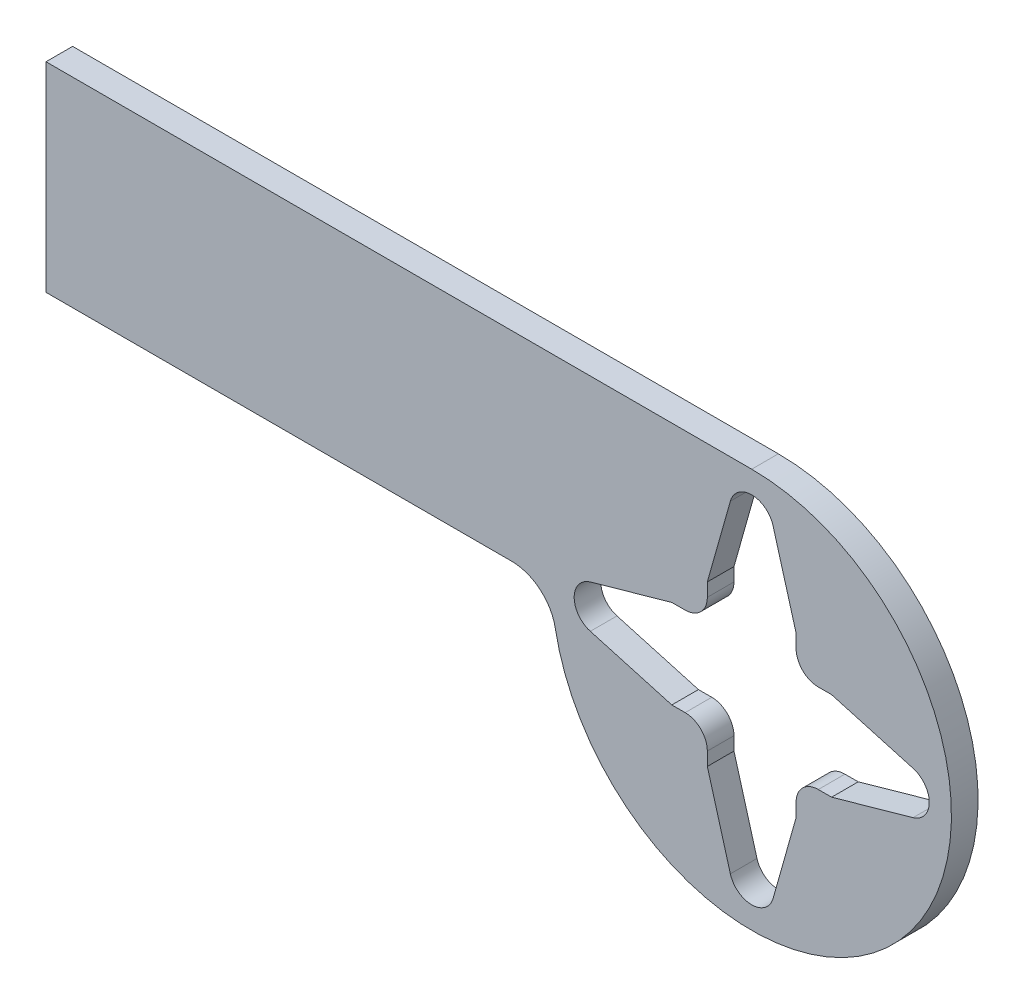
ISO-10303-21;
HEADER;
FILE_DESCRIPTION(('STEP AP214'),'2;1');
FILE_NAME('part.step','',(''),(''),'','','');
FILE_SCHEMA(('AUTOMOTIVE_DESIGN { 1 0 10303 214 1 1 1 1 }'));
ENDSEC;
DATA;
#1=APPLICATION_CONTEXT('core data for automotive mechanical design processes');
#2=APPLICATION_PROTOCOL_DEFINITION('international standard','automotive_design',2000,#1);
#3=PRODUCT_CONTEXT('',#1,'mechanical');
#4=PRODUCT('Part','Part','',(#3));
#5=PRODUCT_RELATED_PRODUCT_CATEGORY('part','',(#4));
#6=PRODUCT_DEFINITION_FORMATION('','',#4);
#7=PRODUCT_DEFINITION_CONTEXT('part definition',#1,'design');
#8=PRODUCT_DEFINITION('design','',#6,#7);
#9=PRODUCT_DEFINITION_SHAPE('','',#8);
#10=(LENGTH_UNIT() NAMED_UNIT(*) SI_UNIT(.MILLI.,.METRE.));
#11=(NAMED_UNIT(*) PLANE_ANGLE_UNIT() SI_UNIT($,.RADIAN.));
#12=(NAMED_UNIT(*) SI_UNIT($,.STERADIAN.) SOLID_ANGLE_UNIT());
#13=UNCERTAINTY_MEASURE_WITH_UNIT(LENGTH_MEASURE(1.E-05),#10,'distance_accuracy_value','');
#14=(GEOMETRIC_REPRESENTATION_CONTEXT(3) GLOBAL_UNCERTAINTY_ASSIGNED_CONTEXT((#13)) GLOBAL_UNIT_ASSIGNED_CONTEXT((#10,
#11,#12)) REPRESENTATION_CONTEXT('',''));
#15=CARTESIAN_POINT('',(0.,0.,0.));
#16=DIRECTION('',(0.,0.,1.));
#17=DIRECTION('',(1.,0.,0.));
#18=AXIS2_PLACEMENT_3D('',#15,#16,#17);
#19=CARTESIAN_POINT('',(0.,0.,3.));
#20=DIRECTION('',(0.,0.,-1.));
#21=DIRECTION('',(-1.,0.,0.));
#22=AXIS2_PLACEMENT_3D('',#19,#20,#21);
#23=CYLINDRICAL_SURFACE('',#22,22.5);
#24=CARTESIAN_POINT('',(0.,0.,0.));
#25=DIRECTION('',(0.,0.,1.));
#26=DIRECTION('',(1.,0.,0.));
#27=AXIS2_PLACEMENT_3D('',#24,#25,#26);
#28=CIRCLE('',#27,22.5);
#29=CARTESIAN_POINT('',(-22.1249737358018,-4.09090909090909,0.));
#30=VERTEX_POINT('',#29);
#31=CARTESIAN_POINT('',(0.,22.5,0.));
#32=VERTEX_POINT('',#31);
#33=EDGE_CURVE('E355',#30,#32,#28,.T.);
#34=ORIENTED_EDGE('',*,*,#33,.T.);
#35=DIRECTION('',(0.,0.,-1.));
#36=VECTOR('',#35,1.);
#37=CARTESIAN_POINT('',(0.,22.5,3.));
#38=LINE('',#37,#36);
#39=CARTESIAN_POINT('',(0.,22.5,3.));
#40=VERTEX_POINT('',#39);
#41=EDGE_CURVE('E195',#40,#32,#38,.T.);
#42=ORIENTED_EDGE('',*,*,#41,.F.);
#43=CARTESIAN_POINT('',(0.,0.,3.));
#44=DIRECTION('',(0.,0.,1.));
#45=DIRECTION('',(1.,0.,0.));
#46=AXIS2_PLACEMENT_3D('',#43,#44,#45);
#47=CIRCLE('',#46,22.5);
#48=CARTESIAN_POINT('',(-22.1249737358018,-4.09090909090909,3.));
#49=VERTEX_POINT('',#48);
#50=EDGE_CURVE('E378',#49,#40,#47,.T.);
#51=ORIENTED_EDGE('',*,*,#50,.F.);
#52=DIRECTION('',(0.,0.,-1.));
#53=VECTOR('',#52,1.);
#54=CARTESIAN_POINT('',(-22.1249737358018,-4.09090909090909,3.));
#55=LINE('',#54,#53);
#56=EDGE_CURVE('E12',#49,#30,#55,.T.);
#57=ORIENTED_EDGE('',*,*,#56,.T.);
#58=EDGE_LOOP('',(#34,#42,#51,#57));
#59=FACE_BOUND('',#58,.T.);
#60=ADVANCED_FACE('F184',(#59),#23,.T.);
#61=CARTESIAN_POINT('',(5.,0.,3.));
#62=DIRECTION('',(1.,0.,0.));
#63=DIRECTION('',(0.,0.,-1.));
#64=AXIS2_PLACEMENT_3D('',#61,#62,#63);
#65=PLANE('',#64);
#66=DIRECTION('',(0.,-1.,0.));
#67=VECTOR('',#66,1.);
#68=CARTESIAN_POINT('',(5.,0.,0.));
#69=LINE('',#68,#67);
#70=CARTESIAN_POINT('',(5.,-7.5,0.));
#71=VERTEX_POINT('',#70);
#72=CARTESIAN_POINT('',(5.,-9.,0.));
#73=VERTEX_POINT('',#72);
#74=EDGE_CURVE('E456',#71,#73,#69,.T.);
#75=ORIENTED_EDGE('',*,*,#74,.T.);
#76=DIRECTION('',(0.,0.,-1.));
#77=VECTOR('',#76,1.);
#78=CARTESIAN_POINT('',(5.,-9.,3.));
#79=LINE('',#78,#77);
#80=CARTESIAN_POINT('',(5.,-9.,3.));
#81=VERTEX_POINT('',#80);
#82=EDGE_CURVE('E446',#81,#73,#79,.T.);
#83=ORIENTED_EDGE('',*,*,#82,.F.);
#84=DIRECTION('',(0.,-1.,0.));
#85=VECTOR('',#84,1.);
#86=CARTESIAN_POINT('',(5.,0.,3.));
#87=LINE('',#86,#85);
#88=CARTESIAN_POINT('',(5.,-7.5,3.));
#89=VERTEX_POINT('',#88);
#90=EDGE_CURVE('E358',#89,#81,#87,.T.);
#91=ORIENTED_EDGE('',*,*,#90,.F.);
#92=DIRECTION('',(0.,0.,-1.));
#93=VECTOR('',#92,1.);
#94=CARTESIAN_POINT('',(5.,-7.5,3.));
#95=LINE('',#94,#93);
#96=EDGE_CURVE('E372',#89,#71,#95,.T.);
#97=ORIENTED_EDGE('',*,*,#96,.T.);
#98=EDGE_LOOP('',(#75,#83,#91,#97));
#99=FACE_BOUND('',#98,.T.);
#100=ADVANCED_FACE('F820',(#99),#65,.F.);
#101=CARTESIAN_POINT('',(6.98551163473582,-1.97409711694024,3.));
#102=DIRECTION('',(0.962311898410698,-0.271948175535705,0.));
#103=DIRECTION('',(0.271948175535705,0.962311898410698,0.));
#104=AXIS2_PLACEMENT_3D('',#101,#102,#103);
#105=PLANE('',#104);
#106=DIRECTION('',(-0.271948175535705,-0.962311898410698,0.));
#107=VECTOR('',#106,1.);
#108=CARTESIAN_POINT('',(6.98551163473582,-1.97409711694024,0.));
#109=LINE('',#108,#107);
#110=CARTESIAN_POINT('',(2.40577974602674,-18.1798704388393,0.));
#111=VERTEX_POINT('',#110);
#112=EDGE_CURVE('E500',#73,#111,#109,.T.);
#113=ORIENTED_EDGE('',*,*,#112,.T.);
#114=DIRECTION('',(0.,0.,-1.));
#115=VECTOR('',#114,1.);
#116=CARTESIAN_POINT('',(2.40577974602674,-18.1798704388393,3.));
#117=LINE('',#116,#115);
#118=CARTESIAN_POINT('',(2.40577974602674,-18.1798704388393,3.));
#119=VERTEX_POINT('',#118);
#120=EDGE_CURVE('E442',#119,#111,#117,.T.);
#121=ORIENTED_EDGE('',*,*,#120,.F.);
#122=DIRECTION('',(-0.271948175535705,-0.962311898410698,0.));
#123=VECTOR('',#122,1.);
#124=CARTESIAN_POINT('',(6.98551163473582,-1.97409711694024,3.));
#125=LINE('',#124,#123);
#126=EDGE_CURVE('E364',#81,#119,#125,.T.);
#127=ORIENTED_EDGE('',*,*,#126,.F.);
#128=ORIENTED_EDGE('',*,*,#82,.T.);
#129=EDGE_LOOP('',(#113,#121,#127,#128));
#130=FACE_BOUND('',#129,.T.);
#131=ADVANCED_FACE('F703',(#130),#105,.F.);
#132=CARTESIAN_POINT('',(0.,-17.5,3.));
#133=DIRECTION('',(0.,0.,-1.));
#134=DIRECTION('',(-1.,0.,0.));
#135=AXIS2_PLACEMENT_3D('',#132,#133,#134);
#136=CYLINDRICAL_SURFACE('',#135,2.5);
#137=CARTESIAN_POINT('',(0.,-17.5,0.));
#138=DIRECTION('',(0.,0.,1.));
#139=DIRECTION('',(1.,0.,0.));
#140=AXIS2_PLACEMENT_3D('',#137,#138,#139);
#141=CIRCLE('',#140,2.5);
#142=CARTESIAN_POINT('',(-2.40577974602674,-18.1798704388393,0.));
#143=VERTEX_POINT('',#142);
#144=EDGE_CURVE('E503',#111,#143,#141,.F.);
#145=ORIENTED_EDGE('',*,*,#144,.T.);
#146=DIRECTION('',(0.,0.,-1.));
#147=VECTOR('',#146,1.);
#148=CARTESIAN_POINT('',(-2.40577974602674,-18.1798704388393,3.));
#149=LINE('',#148,#147);
#150=CARTESIAN_POINT('',(-2.40577974602674,-18.1798704388393,3.));
#151=VERTEX_POINT('',#150);
#152=EDGE_CURVE('E439',#151,#143,#149,.T.);
#153=ORIENTED_EDGE('',*,*,#152,.F.);
#154=CARTESIAN_POINT('',(0.,-17.5,3.));
#155=DIRECTION('',(0.,0.,1.));
#156=DIRECTION('',(1.,0.,0.));
#157=AXIS2_PLACEMENT_3D('',#154,#155,#156);
#158=CIRCLE('',#157,2.5);
#159=EDGE_CURVE('E686',#119,#151,#158,.F.);
#160=ORIENTED_EDGE('',*,*,#159,.F.);
#161=ORIENTED_EDGE('',*,*,#120,.T.);
#162=EDGE_LOOP('',(#145,#153,#160,#161));
#163=FACE_BOUND('',#162,.T.);
#164=ADVANCED_FACE('F707',(#163),#136,.F.);
#165=CARTESIAN_POINT('',(-6.98551163473582,-1.97409711694024,3.));
#166=DIRECTION('',(0.962311898410698,0.271948175535705,0.));
#167=DIRECTION('',(-0.271948175535705,0.962311898410698,0.));
#168=AXIS2_PLACEMENT_3D('',#165,#166,#167);
#169=PLANE('',#168);
#170=DIRECTION('',(0.271948175535705,-0.962311898410698,0.));
#171=VECTOR('',#170,1.);
#172=CARTESIAN_POINT('',(-6.98551163473582,-1.97409711694024,0.));
#173=LINE('',#172,#171);
#174=CARTESIAN_POINT('',(-5.,-9.,0.));
#175=VERTEX_POINT('',#174);
#176=EDGE_CURVE('E507',#175,#143,#173,.T.);
#177=ORIENTED_EDGE('',*,*,#176,.F.);
#178=DIRECTION('',(0.,0.,-1.));
#179=VECTOR('',#178,1.);
#180=CARTESIAN_POINT('',(-5.,-9.,3.));
#181=LINE('',#180,#179);
#182=CARTESIAN_POINT('',(-5.,-9.,3.));
#183=VERTEX_POINT('',#182);
#184=EDGE_CURVE('E436',#183,#175,#181,.T.);
#185=ORIENTED_EDGE('',*,*,#184,.F.);
#186=DIRECTION('',(0.271948175535705,-0.962311898410698,0.));
#187=VECTOR('',#186,1.);
#188=CARTESIAN_POINT('',(-6.98551163473582,-1.97409711694024,3.));
#189=LINE('',#188,#187);
#190=EDGE_CURVE('E682',#183,#151,#189,.T.);
#191=ORIENTED_EDGE('',*,*,#190,.T.);
#192=ORIENTED_EDGE('',*,*,#152,.T.);
#193=EDGE_LOOP('',(#177,#185,#191,#192));
#194=FACE_BOUND('',#193,.T.);
#195=ADVANCED_FACE('F713',(#194),#169,.T.);
#196=CARTESIAN_POINT('',(-5.,0.,3.));
#197=DIRECTION('',(1.,0.,0.));
#198=DIRECTION('',(0.,0.,-1.));
#199=AXIS2_PLACEMENT_3D('',#196,#197,#198);
#200=PLANE('',#199);
#201=DIRECTION('',(0.,-1.,0.));
#202=VECTOR('',#201,1.);
#203=CARTESIAN_POINT('',(-5.,0.,0.));
#204=LINE('',#203,#202);
#205=CARTESIAN_POINT('',(-5.,-7.5,0.));
#206=VERTEX_POINT('',#205);
#207=EDGE_CURVE('E511',#206,#175,#204,.T.);
#208=ORIENTED_EDGE('',*,*,#207,.F.);
#209=DIRECTION('',(0.,0.,-1.));
#210=VECTOR('',#209,1.);
#211=CARTESIAN_POINT('',(-5.,-7.5,3.));
#212=LINE('',#211,#210);
#213=CARTESIAN_POINT('',(-5.,-7.5,3.));
#214=VERTEX_POINT('',#213);
#215=EDGE_CURVE('E433',#214,#206,#212,.T.);
#216=ORIENTED_EDGE('',*,*,#215,.F.);
#217=DIRECTION('',(0.,-1.,0.));
#218=VECTOR('',#217,1.);
#219=CARTESIAN_POINT('',(-5.,0.,3.));
#220=LINE('',#219,#218);
#221=EDGE_CURVE('E678',#214,#183,#220,.T.);
#222=ORIENTED_EDGE('',*,*,#221,.T.);
#223=ORIENTED_EDGE('',*,*,#184,.T.);
#224=EDGE_LOOP('',(#208,#216,#222,#223));
#225=FACE_BOUND('',#224,.T.);
#226=ADVANCED_FACE('F721',(#225),#200,.T.);
#227=CARTESIAN_POINT('',(0.,-5.,3.));
#228=DIRECTION('',(0.,-1.,0.));
#229=DIRECTION('',(1.,0.,0.));
#230=AXIS2_PLACEMENT_3D('',#227,#228,#229);
#231=PLANE('',#230);
#232=DIRECTION('',(-1.,0.,0.));
#233=VECTOR('',#232,1.);
#234=CARTESIAN_POINT('',(0.,-5.,0.));
#235=LINE('',#234,#233);
#236=CARTESIAN_POINT('',(-7.5,-5.,0.));
#237=VERTEX_POINT('',#236);
#238=CARTESIAN_POINT('',(-9.,-5.,0.));
#239=VERTEX_POINT('',#238);
#240=EDGE_CURVE('E515',#237,#239,#235,.T.);
#241=ORIENTED_EDGE('',*,*,#240,.T.);
#242=DIRECTION('',(0.,0.,-1.));
#243=VECTOR('',#242,1.);
#244=CARTESIAN_POINT('',(-9.,-5.,3.));
#245=LINE('',#244,#243);
#246=CARTESIAN_POINT('',(-9.,-5.,3.));
#247=VERTEX_POINT('',#246);
#248=EDGE_CURVE('E426',#247,#239,#245,.T.);
#249=ORIENTED_EDGE('',*,*,#248,.F.);
#250=DIRECTION('',(-1.,0.,0.));
#251=VECTOR('',#250,1.);
#252=CARTESIAN_POINT('',(0.,-5.,3.));
#253=LINE('',#252,#251);
#254=CARTESIAN_POINT('',(-7.5,-5.,3.));
#255=VERTEX_POINT('',#254);
#256=EDGE_CURVE('E674',#255,#247,#253,.T.);
#257=ORIENTED_EDGE('',*,*,#256,.F.);
#258=DIRECTION('',(0.,0.,-1.));
#259=VECTOR('',#258,1.);
#260=CARTESIAN_POINT('',(-7.5,-5.,3.));
#261=LINE('',#260,#259);
#262=EDGE_CURVE('E430',#255,#237,#261,.T.);
#263=ORIENTED_EDGE('',*,*,#262,.T.);
#264=EDGE_LOOP('',(#241,#249,#257,#263));
#265=FACE_BOUND('',#264,.T.);
#266=ADVANCED_FACE('F733',(#265),#231,.F.);
#267=CARTESIAN_POINT('',(-1.97409711694023,-6.98551163473581,3.));
#268=DIRECTION('',(-0.271948175535704,-0.962311898410698,0.));
#269=DIRECTION('',(0.962311898410698,-0.271948175535704,0.));
#270=AXIS2_PLACEMENT_3D('',#267,#268,#269);
#271=PLANE('',#270);
#272=DIRECTION('',(-0.962311898410698,0.271948175535704,0.));
#273=VECTOR('',#272,1.);
#274=CARTESIAN_POINT('',(-1.97409711694023,-6.98551163473581,0.));
#275=LINE('',#274,#273);
#276=CARTESIAN_POINT('',(-18.1798704388393,-2.40577974602675,0.));
#277=VERTEX_POINT('',#276);
#278=EDGE_CURVE('E518',#239,#277,#275,.T.);
#279=ORIENTED_EDGE('',*,*,#278,.T.);
#280=DIRECTION('',(0.,0.,-1.));
#281=VECTOR('',#280,1.);
#282=CARTESIAN_POINT('',(-18.1798704388393,-2.40577974602675,3.));
#283=LINE('',#282,#281);
#284=CARTESIAN_POINT('',(-18.1798704388393,-2.40577974602675,3.));
#285=VERTEX_POINT('',#284);
#286=EDGE_CURVE('E422',#285,#277,#283,.T.);
#287=ORIENTED_EDGE('',*,*,#286,.F.);
#288=DIRECTION('',(-0.962311898410698,0.271948175535704,0.));
#289=VECTOR('',#288,1.);
#290=CARTESIAN_POINT('',(-1.97409711694023,-6.98551163473581,3.));
#291=LINE('',#290,#289);
#292=EDGE_CURVE('E670',#247,#285,#291,.T.);
#293=ORIENTED_EDGE('',*,*,#292,.F.);
#294=ORIENTED_EDGE('',*,*,#248,.T.);
#295=EDGE_LOOP('',(#279,#287,#293,#294));
#296=FACE_BOUND('',#295,.T.);
#297=ADVANCED_FACE('F741',(#296),#271,.F.);
#298=CARTESIAN_POINT('',(-17.5,0.,3.));
#299=DIRECTION('',(0.,0.,-1.));
#300=DIRECTION('',(-1.,0.,0.));
#301=AXIS2_PLACEMENT_3D('',#298,#299,#300);
#302=CYLINDRICAL_SURFACE('',#301,2.5);
#303=CARTESIAN_POINT('',(-17.5,0.,0.));
#304=DIRECTION('',(0.,0.,1.));
#305=DIRECTION('',(1.,0.,0.));
#306=AXIS2_PLACEMENT_3D('',#303,#304,#305);
#307=CIRCLE('',#306,2.5);
#308=CARTESIAN_POINT('',(-18.1798704388393,2.40577974602675,0.));
#309=VERTEX_POINT('',#308);
#310=EDGE_CURVE('E521',#277,#309,#307,.F.);
#311=ORIENTED_EDGE('',*,*,#310,.T.);
#312=DIRECTION('',(0.,0.,-1.));
#313=VECTOR('',#312,1.);
#314=CARTESIAN_POINT('',(-18.1798704388393,2.40577974602675,3.));
#315=LINE('',#314,#313);
#316=CARTESIAN_POINT('',(-18.1798704388393,2.40577974602675,3.));
#317=VERTEX_POINT('',#316);
#318=EDGE_CURVE('E419',#317,#309,#315,.T.);
#319=ORIENTED_EDGE('',*,*,#318,.F.);
#320=CARTESIAN_POINT('',(-17.5,0.,3.));
#321=DIRECTION('',(0.,0.,1.));
#322=DIRECTION('',(1.,0.,0.));
#323=AXIS2_PLACEMENT_3D('',#320,#321,#322);
#324=CIRCLE('',#323,2.5);
#325=EDGE_CURVE('E666',#285,#317,#324,.F.);
#326=ORIENTED_EDGE('',*,*,#325,.F.);
#327=ORIENTED_EDGE('',*,*,#286,.T.);
#328=EDGE_LOOP('',(#311,#319,#326,#327));
#329=FACE_BOUND('',#328,.T.);
#330=ADVANCED_FACE('F793',(#329),#302,.F.);
#331=CARTESIAN_POINT('',(-1.97409711694023,6.98551163473581,3.));
#332=DIRECTION('',(0.271948175535704,-0.962311898410698,0.));
#333=DIRECTION('',(0.962311898410698,0.271948175535704,0.));
#334=AXIS2_PLACEMENT_3D('',#331,#332,#333);
#335=PLANE('',#334);
#336=DIRECTION('',(-0.962311898410698,-0.271948175535704,0.));
#337=VECTOR('',#336,1.);
#338=CARTESIAN_POINT('',(-1.97409711694023,6.98551163473581,0.));
#339=LINE('',#338,#337);
#340=CARTESIAN_POINT('',(-9.,5.,0.));
#341=VERTEX_POINT('',#340);
#342=EDGE_CURVE('E525',#341,#309,#339,.T.);
#343=ORIENTED_EDGE('',*,*,#342,.F.);
#344=DIRECTION('',(0.,0.,-1.));
#345=VECTOR('',#344,1.);
#346=CARTESIAN_POINT('',(-9.,5.,3.));
#347=LINE('',#346,#345);
#348=CARTESIAN_POINT('',(-9.,5.,3.));
#349=VERTEX_POINT('',#348);
#350=EDGE_CURVE('E416',#349,#341,#347,.T.);
#351=ORIENTED_EDGE('',*,*,#350,.F.);
#352=DIRECTION('',(-0.962311898410698,-0.271948175535704,0.));
#353=VECTOR('',#352,1.);
#354=CARTESIAN_POINT('',(-1.97409711694023,6.98551163473581,3.));
#355=LINE('',#354,#353);
#356=EDGE_CURVE('E662',#349,#317,#355,.T.);
#357=ORIENTED_EDGE('',*,*,#356,.T.);
#358=ORIENTED_EDGE('',*,*,#318,.T.);
#359=EDGE_LOOP('',(#343,#351,#357,#358));
#360=FACE_BOUND('',#359,.T.);
#361=ADVANCED_FACE('F790',(#360),#335,.T.);
#362=CARTESIAN_POINT('',(0.,5.,3.));
#363=DIRECTION('',(0.,-1.,0.));
#364=DIRECTION('',(1.,0.,0.));
#365=AXIS2_PLACEMENT_3D('',#362,#363,#364);
#366=PLANE('',#365);
#367=DIRECTION('',(-1.,0.,0.));
#368=VECTOR('',#367,1.);
#369=CARTESIAN_POINT('',(0.,5.,0.));
#370=LINE('',#369,#368);
#371=CARTESIAN_POINT('',(-7.5,5.,0.));
#372=VERTEX_POINT('',#371);
#373=EDGE_CURVE('E529',#372,#341,#370,.T.);
#374=ORIENTED_EDGE('',*,*,#373,.F.);
#375=DIRECTION('',(0.,0.,-1.));
#376=VECTOR('',#375,1.);
#377=CARTESIAN_POINT('',(-7.5,5.,3.));
#378=LINE('',#377,#376);
#379=CARTESIAN_POINT('',(-7.5,5.,3.));
#380=VERTEX_POINT('',#379);
#381=EDGE_CURVE('E413',#380,#372,#378,.T.);
#382=ORIENTED_EDGE('',*,*,#381,.F.);
#383=DIRECTION('',(-1.,0.,0.));
#384=VECTOR('',#383,1.);
#385=CARTESIAN_POINT('',(0.,5.,3.));
#386=LINE('',#385,#384);
#387=EDGE_CURVE('E658',#380,#349,#386,.T.);
#388=ORIENTED_EDGE('',*,*,#387,.T.);
#389=ORIENTED_EDGE('',*,*,#350,.T.);
#390=EDGE_LOOP('',(#374,#382,#388,#389));
#391=FACE_BOUND('',#390,.T.);
#392=ADVANCED_FACE('F786',(#391),#366,.T.);
#393=CARTESIAN_POINT('',(-5.,0.,3.));
#394=DIRECTION('',(-1.,0.,0.));
#395=DIRECTION('',(0.,0.,1.));
#396=AXIS2_PLACEMENT_3D('',#393,#394,#395);
#397=PLANE('',#396);
#398=DIRECTION('',(0.,1.,0.));
#399=VECTOR('',#398,1.);
#400=CARTESIAN_POINT('',(-5.,0.,0.));
#401=LINE('',#400,#399);
#402=CARTESIAN_POINT('',(-5.,7.5,0.));
#403=VERTEX_POINT('',#402);
#404=CARTESIAN_POINT('',(-5.,9.,0.));
#405=VERTEX_POINT('',#404);
#406=EDGE_CURVE('E533',#403,#405,#401,.T.);
#407=ORIENTED_EDGE('',*,*,#406,.T.);
#408=DIRECTION('',(0.,0.,-1.));
#409=VECTOR('',#408,1.);
#410=CARTESIAN_POINT('',(-5.,9.,3.));
#411=LINE('',#410,#409);
#412=CARTESIAN_POINT('',(-5.,9.,3.));
#413=VERTEX_POINT('',#412);
#414=EDGE_CURVE('E406',#413,#405,#411,.T.);
#415=ORIENTED_EDGE('',*,*,#414,.F.);
#416=DIRECTION('',(0.,1.,0.));
#417=VECTOR('',#416,1.);
#418=CARTESIAN_POINT('',(-5.,0.,3.));
#419=LINE('',#418,#417);
#420=CARTESIAN_POINT('',(-5.,7.5,3.));
#421=VERTEX_POINT('',#420);
#422=EDGE_CURVE('E654',#421,#413,#419,.T.);
#423=ORIENTED_EDGE('',*,*,#422,.F.);
#424=DIRECTION('',(0.,0.,-1.));
#425=VECTOR('',#424,1.);
#426=CARTESIAN_POINT('',(-5.,7.5,3.));
#427=LINE('',#426,#425);
#428=EDGE_CURVE('E410',#421,#403,#427,.T.);
#429=ORIENTED_EDGE('',*,*,#428,.T.);
#430=EDGE_LOOP('',(#407,#415,#423,#429));
#431=FACE_BOUND('',#430,.T.);
#432=ADVANCED_FACE('F780',(#431),#397,.F.);
#433=CARTESIAN_POINT('',(-6.98551163473582,1.97409711694024,3.));
#434=DIRECTION('',(-0.962311898410698,0.271948175535705,0.));
#435=DIRECTION('',(-0.271948175535705,-0.962311898410698,0.));
#436=AXIS2_PLACEMENT_3D('',#433,#434,#435);
#437=PLANE('',#436);
#438=DIRECTION('',(0.271948175535705,0.962311898410698,0.));
#439=VECTOR('',#438,1.);
#440=CARTESIAN_POINT('',(-6.98551163473582,1.97409711694024,0.));
#441=LINE('',#440,#439);
#442=CARTESIAN_POINT('',(-2.40577974602674,18.1798704388393,0.));
#443=VERTEX_POINT('',#442);
#444=EDGE_CURVE('E536',#405,#443,#441,.T.);
#445=ORIENTED_EDGE('',*,*,#444,.T.);
#446=DIRECTION('',(0.,0.,-1.));
#447=VECTOR('',#446,1.);
#448=CARTESIAN_POINT('',(-2.40577974602674,18.1798704388393,3.));
#449=LINE('',#448,#447);
#450=CARTESIAN_POINT('',(-2.40577974602674,18.1798704388393,3.));
#451=VERTEX_POINT('',#450);
#452=EDGE_CURVE('E403',#451,#443,#449,.T.);
#453=ORIENTED_EDGE('',*,*,#452,.F.);
#454=DIRECTION('',(0.271948175535705,0.962311898410698,0.));
#455=VECTOR('',#454,1.);
#456=CARTESIAN_POINT('',(-6.98551163473582,1.97409711694024,3.));
#457=LINE('',#456,#455);
#458=EDGE_CURVE('E650',#413,#451,#457,.T.);
#459=ORIENTED_EDGE('',*,*,#458,.F.);
#460=ORIENTED_EDGE('',*,*,#414,.T.);
#461=EDGE_LOOP('',(#445,#453,#459,#460));
#462=FACE_BOUND('',#461,.T.);
#463=ADVANCED_FACE('F776',(#462),#437,.F.);
#464=CARTESIAN_POINT('',(0.,17.5,3.));
#465=DIRECTION('',(0.,0.,-1.));
#466=DIRECTION('',(-1.,0.,0.));
#467=AXIS2_PLACEMENT_3D('',#464,#465,#466);
#468=CYLINDRICAL_SURFACE('',#467,2.5);
#469=CARTESIAN_POINT('',(0.,17.5,0.));
#470=DIRECTION('',(0.,0.,1.));
#471=DIRECTION('',(1.,0.,0.));
#472=AXIS2_PLACEMENT_3D('',#469,#470,#471);
#473=CIRCLE('',#472,2.5);
#474=CARTESIAN_POINT('',(2.40577974602674,18.1798704388393,0.));
#475=VERTEX_POINT('',#474);
#476=EDGE_CURVE('E540',#475,#443,#473,.T.);
#477=ORIENTED_EDGE('',*,*,#476,.F.);
#478=DIRECTION('',(0.,0.,-1.));
#479=VECTOR('',#478,1.);
#480=CARTESIAN_POINT('',(2.40577974602674,18.1798704388393,3.));
#481=LINE('',#480,#479);
#482=CARTESIAN_POINT('',(2.40577974602674,18.1798704388393,3.));
#483=VERTEX_POINT('',#482);
#484=EDGE_CURVE('E400',#483,#475,#481,.T.);
#485=ORIENTED_EDGE('',*,*,#484,.F.);
#486=CARTESIAN_POINT('',(0.,17.5,3.));
#487=DIRECTION('',(0.,0.,1.));
#488=DIRECTION('',(1.,0.,0.));
#489=AXIS2_PLACEMENT_3D('',#486,#487,#488);
#490=CIRCLE('',#489,2.5);
#491=EDGE_CURVE('E646',#483,#451,#490,.T.);
#492=ORIENTED_EDGE('',*,*,#491,.T.);
#493=ORIENTED_EDGE('',*,*,#452,.T.);
#494=EDGE_LOOP('',(#477,#485,#492,#493));
#495=FACE_BOUND('',#494,.T.);
#496=ADVANCED_FACE('F765',(#495),#468,.F.);
#497=CARTESIAN_POINT('',(6.98551163473582,1.97409711694024,3.));
#498=DIRECTION('',(-0.962311898410698,-0.271948175535705,0.));
#499=DIRECTION('',(0.271948175535705,-0.962311898410698,0.));
#500=AXIS2_PLACEMENT_3D('',#497,#498,#499);
#501=PLANE('',#500);
#502=DIRECTION('',(-0.271948175535705,0.962311898410698,0.));
#503=VECTOR('',#502,1.);
#504=CARTESIAN_POINT('',(6.98551163473582,1.97409711694024,0.));
#505=LINE('',#504,#503);
#506=CARTESIAN_POINT('',(5.,9.,0.));
#507=VERTEX_POINT('',#506);
#508=EDGE_CURVE('E544',#507,#475,#505,.T.);
#509=ORIENTED_EDGE('',*,*,#508,.F.);
#510=DIRECTION('',(0.,0.,-1.));
#511=VECTOR('',#510,1.);
#512=CARTESIAN_POINT('',(5.,9.,3.));
#513=LINE('',#512,#511);
#514=CARTESIAN_POINT('',(5.,9.,3.));
#515=VERTEX_POINT('',#514);
#516=EDGE_CURVE('E397',#515,#507,#513,.T.);
#517=ORIENTED_EDGE('',*,*,#516,.F.);
#518=DIRECTION('',(-0.271948175535705,0.962311898410698,0.));
#519=VECTOR('',#518,1.);
#520=CARTESIAN_POINT('',(6.98551163473582,1.97409711694024,3.));
#521=LINE('',#520,#519);
#522=EDGE_CURVE('E642',#515,#483,#521,.T.);
#523=ORIENTED_EDGE('',*,*,#522,.T.);
#524=ORIENTED_EDGE('',*,*,#484,.T.);
#525=EDGE_LOOP('',(#509,#517,#523,#524));
#526=FACE_BOUND('',#525,.T.);
#527=ADVANCED_FACE('F771',(#526),#501,.T.);
#528=CARTESIAN_POINT('',(5.,0.,3.));
#529=DIRECTION('',(-1.,0.,0.));
#530=DIRECTION('',(0.,0.,1.));
#531=AXIS2_PLACEMENT_3D('',#528,#529,#530);
#532=PLANE('',#531);
#533=DIRECTION('',(0.,1.,0.));
#534=VECTOR('',#533,1.);
#535=CARTESIAN_POINT('',(5.,0.,0.));
#536=LINE('',#535,#534);
#537=CARTESIAN_POINT('',(5.,7.5,0.));
#538=VERTEX_POINT('',#537);
#539=EDGE_CURVE('E548',#538,#507,#536,.T.);
#540=ORIENTED_EDGE('',*,*,#539,.F.);
#541=DIRECTION('',(0.,0.,-1.));
#542=VECTOR('',#541,1.);
#543=CARTESIAN_POINT('',(5.,7.5,3.));
#544=LINE('',#543,#542);
#545=CARTESIAN_POINT('',(5.,7.5,3.));
#546=VERTEX_POINT('',#545);
#547=EDGE_CURVE('E394',#546,#538,#544,.T.);
#548=ORIENTED_EDGE('',*,*,#547,.F.);
#549=DIRECTION('',(0.,1.,0.));
#550=VECTOR('',#549,1.);
#551=CARTESIAN_POINT('',(5.,0.,3.));
#552=LINE('',#551,#550);
#553=EDGE_CURVE('E610',#546,#515,#552,.T.);
#554=ORIENTED_EDGE('',*,*,#553,.T.);
#555=ORIENTED_EDGE('',*,*,#516,.T.);
#556=EDGE_LOOP('',(#540,#548,#554,#555));
#557=FACE_BOUND('',#556,.T.);
#558=ADVANCED_FACE('F608',(#557),#532,.T.);
#559=CARTESIAN_POINT('',(0.,5.,3.));
#560=DIRECTION('',(0.,1.,0.));
#561=DIRECTION('',(-1.,0.,0.));
#562=AXIS2_PLACEMENT_3D('',#559,#560,#561);
#563=PLANE('',#562);
#564=DIRECTION('',(1.,0.,0.));
#565=VECTOR('',#564,1.);
#566=CARTESIAN_POINT('',(0.,5.,0.));
#567=LINE('',#566,#565);
#568=CARTESIAN_POINT('',(7.5,5.,0.));
#569=VERTEX_POINT('',#568);
#570=CARTESIAN_POINT('',(9.,5.,0.));
#571=VERTEX_POINT('',#570);
#572=EDGE_CURVE('E552',#569,#571,#567,.T.);
#573=ORIENTED_EDGE('',*,*,#572,.T.);
#574=DIRECTION('',(0.,0.,-1.));
#575=VECTOR('',#574,1.);
#576=CARTESIAN_POINT('',(9.,5.,3.));
#577=LINE('',#576,#575);
#578=CARTESIAN_POINT('',(9.,5.,3.));
#579=VERTEX_POINT('',#578);
#580=EDGE_CURVE('E387',#579,#571,#577,.T.);
#581=ORIENTED_EDGE('',*,*,#580,.F.);
#582=DIRECTION('',(1.,0.,0.));
#583=VECTOR('',#582,1.);
#584=CARTESIAN_POINT('',(0.,5.,3.));
#585=LINE('',#584,#583);
#586=CARTESIAN_POINT('',(7.5,5.,3.));
#587=VERTEX_POINT('',#586);
#588=EDGE_CURVE('E599',#587,#579,#585,.T.);
#589=ORIENTED_EDGE('',*,*,#588,.F.);
#590=DIRECTION('',(0.,0.,-1.));
#591=VECTOR('',#590,1.);
#592=CARTESIAN_POINT('',(7.5,5.,3.));
#593=LINE('',#592,#591);
#594=EDGE_CURVE('E391',#587,#569,#593,.T.);
#595=ORIENTED_EDGE('',*,*,#594,.T.);
#596=EDGE_LOOP('',(#573,#581,#589,#595));
#597=FACE_BOUND('',#596,.T.);
#598=ADVANCED_FACE('F593',(#597),#563,.F.);
#599=CARTESIAN_POINT('',(1.97409711694023,6.98551163473581,3.));
#600=DIRECTION('',(0.271948175535704,0.962311898410698,0.));
#601=DIRECTION('',(-0.962311898410698,0.271948175535704,0.));
#602=AXIS2_PLACEMENT_3D('',#599,#600,#601);
#603=PLANE('',#602);
#604=DIRECTION('',(0.962311898410698,-0.271948175535704,0.));
#605=VECTOR('',#604,1.);
#606=CARTESIAN_POINT('',(1.97409711694023,6.98551163473581,0.));
#607=LINE('',#606,#605);
#608=CARTESIAN_POINT('',(18.1798704388393,2.40577974602675,0.));
#609=VERTEX_POINT('',#608);
#610=EDGE_CURVE('E555',#571,#609,#607,.T.);
#611=ORIENTED_EDGE('',*,*,#610,.T.);
#612=DIRECTION('',(0.,0.,-1.));
#613=VECTOR('',#612,1.);
#614=CARTESIAN_POINT('',(18.1798704388393,2.40577974602675,3.));
#615=LINE('',#614,#613);
#616=CARTESIAN_POINT('',(18.1798704388393,2.40577974602675,3.));
#617=VERTEX_POINT('',#616);
#618=EDGE_CURVE('E384',#617,#609,#615,.T.);
#619=ORIENTED_EDGE('',*,*,#618,.F.);
#620=DIRECTION('',(0.962311898410698,-0.271948175535704,0.));
#621=VECTOR('',#620,1.);
#622=CARTESIAN_POINT('',(1.97409711694023,6.98551163473581,3.));
#623=LINE('',#622,#621);
#624=EDGE_CURVE('E633',#579,#617,#623,.T.);
#625=ORIENTED_EDGE('',*,*,#624,.F.);
#626=ORIENTED_EDGE('',*,*,#580,.T.);
#627=EDGE_LOOP('',(#611,#619,#625,#626));
#628=FACE_BOUND('',#627,.T.);
#629=ADVANCED_FACE('F587',(#628),#603,.F.);
#630=CARTESIAN_POINT('',(17.5,0.,3.));
#631=DIRECTION('',(0.,0.,-1.));
#632=DIRECTION('',(-1.,0.,0.));
#633=AXIS2_PLACEMENT_3D('',#630,#631,#632);
#634=CYLINDRICAL_SURFACE('',#633,2.5);
#635=CARTESIAN_POINT('',(17.5,0.,0.));
#636=DIRECTION('',(0.,0.,1.));
#637=DIRECTION('',(1.,0.,0.));
#638=AXIS2_PLACEMENT_3D('',#635,#636,#637);
#639=CIRCLE('',#638,2.5);
#640=CARTESIAN_POINT('',(18.1798704388393,-2.40577974602675,0.));
#641=VERTEX_POINT('',#640);
#642=EDGE_CURVE('E559',#641,#609,#639,.T.);
#643=ORIENTED_EDGE('',*,*,#642,.F.);
#644=DIRECTION('',(0.,0.,-1.));
#645=VECTOR('',#644,1.);
#646=CARTESIAN_POINT('',(18.1798704388393,-2.40577974602675,3.));
#647=LINE('',#646,#645);
#648=CARTESIAN_POINT('',(18.1798704388393,-2.40577974602675,3.));
#649=VERTEX_POINT('',#648);
#650=EDGE_CURVE('E381',#649,#641,#647,.T.);
#651=ORIENTED_EDGE('',*,*,#650,.F.);
#652=CARTESIAN_POINT('',(17.5,0.,3.));
#653=DIRECTION('',(0.,0.,1.));
#654=DIRECTION('',(1.,0.,0.));
#655=AXIS2_PLACEMENT_3D('',#652,#653,#654);
#656=CIRCLE('',#655,2.5);
#657=EDGE_CURVE('E584',#649,#617,#656,.T.);
#658=ORIENTED_EDGE('',*,*,#657,.T.);
#659=ORIENTED_EDGE('',*,*,#618,.T.);
#660=EDGE_LOOP('',(#643,#651,#658,#659));
#661=FACE_BOUND('',#660,.T.);
#662=ADVANCED_FACE('F581',(#661),#634,.F.);
#663=CARTESIAN_POINT('',(1.97409711694023,-6.98551163473581,3.));
#664=DIRECTION('',(-0.271948175535704,0.962311898410698,0.));
#665=DIRECTION('',(-0.962311898410698,-0.271948175535704,0.));
#666=AXIS2_PLACEMENT_3D('',#663,#664,#665);
#667=PLANE('',#666);
#668=DIRECTION('',(0.962311898410698,0.271948175535704,0.));
#669=VECTOR('',#668,1.);
#670=CARTESIAN_POINT('',(1.97409711694023,-6.98551163473581,0.));
#671=LINE('',#670,#669);
#672=CARTESIAN_POINT('',(9.,-5.,0.));
#673=VERTEX_POINT('',#672);
#674=EDGE_CURVE('E367',#673,#641,#671,.T.);
#675=ORIENTED_EDGE('',*,*,#674,.F.);
#676=DIRECTION('',(0.,0.,-1.));
#677=VECTOR('',#676,1.);
#678=CARTESIAN_POINT('',(9.,-5.,3.));
#679=LINE('',#678,#677);
#680=CARTESIAN_POINT('',(9.,-5.,3.));
#681=VERTEX_POINT('',#680);
#682=EDGE_CURVE('E377',#681,#673,#679,.T.);
#683=ORIENTED_EDGE('',*,*,#682,.F.);
#684=DIRECTION('',(0.962311898410698,0.271948175535704,0.));
#685=VECTOR('',#684,1.);
#686=CARTESIAN_POINT('',(1.97409711694023,-6.98551163473581,3.));
#687=LINE('',#686,#685);
#688=EDGE_CURVE('E494',#681,#649,#687,.T.);
#689=ORIENTED_EDGE('',*,*,#688,.T.);
#690=ORIENTED_EDGE('',*,*,#650,.T.);
#691=EDGE_LOOP('',(#675,#683,#689,#690));
#692=FACE_BOUND('',#691,.T.);
#693=ADVANCED_FACE('F572',(#692),#667,.T.);
#694=CARTESIAN_POINT('',(0.,-5.,3.));
#695=DIRECTION('',(0.,1.,0.));
#696=DIRECTION('',(0.,0.,1.));
#697=AXIS2_PLACEMENT_3D('',#694,#695,#696);
#698=PLANE('',#697);
#699=DIRECTION('',(1.,0.,0.));
#700=VECTOR('',#699,1.);
#701=CARTESIAN_POINT('',(0.,-5.,0.));
#702=LINE('',#701,#700);
#703=CARTESIAN_POINT('',(7.5,-5.,0.));
#704=VERTEX_POINT('',#703);
#705=EDGE_CURVE('E359',#704,#673,#702,.T.);
#706=ORIENTED_EDGE('',*,*,#705,.F.);
#707=DIRECTION('',(0.,0.,-1.));
#708=VECTOR('',#707,1.);
#709=CARTESIAN_POINT('',(7.5,-5.,3.));
#710=LINE('',#709,#708);
#711=CARTESIAN_POINT('',(7.5,-5.,3.));
#712=VERTEX_POINT('',#711);
#713=EDGE_CURVE('E374',#712,#704,#710,.T.);
#714=ORIENTED_EDGE('',*,*,#713,.F.);
#715=DIRECTION('',(1.,0.,0.));
#716=VECTOR('',#715,1.);
#717=CARTESIAN_POINT('',(0.,-5.,3.));
#718=LINE('',#717,#716);
#719=EDGE_CURVE('E490',#712,#681,#718,.T.);
#720=ORIENTED_EDGE('',*,*,#719,.T.);
#721=ORIENTED_EDGE('',*,*,#682,.T.);
#722=EDGE_LOOP('',(#706,#714,#720,#721));
#723=FACE_BOUND('',#722,.T.);
#724=ADVANCED_FACE('F625',(#723),#698,.T.);
#725=CARTESIAN_POINT('',(0.,0.,0.));
#726=DIRECTION('',(0.,0.,1.));
#727=DIRECTION('',(1.,0.,0.));
#728=AXIS2_PLACEMENT_3D('',#725,#726,#727);
#729=PLANE('',#728);
#730=CARTESIAN_POINT('',(-27.0416345659799,-5.,0.));
#731=DIRECTION('',(0.,0.,-1.));
#732=DIRECTION('',(-1.,0.,0.));
#733=AXIS2_PLACEMENT_3D('',#730,#731,#732);
#734=CIRCLE('',#733,5.);
#735=CARTESIAN_POINT('',(-27.0416345659799,0.,0.));
#736=VERTEX_POINT('',#735);
#737=EDGE_CURVE('E188',#736,#30,#734,.T.);
#738=ORIENTED_EDGE('',*,*,#737,.F.);
#739=DIRECTION('',(-1.,0.,0.));
#740=VECTOR('',#739,1.);
#741=CARTESIAN_POINT('',(-22.5,0.,0.));
#742=LINE('',#741,#740);
#743=CARTESIAN_POINT('',(-79.5,0.,0.));
#744=VERTEX_POINT('',#743);
#745=EDGE_CURVE('E313',#736,#744,#742,.T.);
#746=ORIENTED_EDGE('',*,*,#745,.T.);
#747=DIRECTION('',(0.,-1.,0.));
#748=VECTOR('',#747,1.);
#749=CARTESIAN_POINT('',(-79.5,22.5,0.));
#750=LINE('',#749,#748);
#751=CARTESIAN_POINT('',(-79.5,22.5,0.));
#752=VERTEX_POINT('',#751);
#753=EDGE_CURVE('E329',#752,#744,#750,.T.);
#754=ORIENTED_EDGE('',*,*,#753,.F.);
#755=DIRECTION('',(1.,0.,0.));
#756=VECTOR('',#755,1.);
#757=CARTESIAN_POINT('',(-22.5,22.5,0.));
#758=LINE('',#757,#756);
#759=EDGE_CURVE('E315',#752,#32,#758,.T.);
#760=ORIENTED_EDGE('',*,*,#759,.T.);
#761=ORIENTED_EDGE('',*,*,#33,.F.);
#762=EDGE_LOOP('',(#738,#746,#754,#760,#761));
#763=FACE_BOUND('',#762,.T.);
#764=ORIENTED_EDGE('',*,*,#74,.F.);
#765=CARTESIAN_POINT('',(7.5,-7.5,0.));
#766=DIRECTION('',(0.,0.,1.));
#767=DIRECTION('',(1.,0.,0.));
#768=AXIS2_PLACEMENT_3D('',#765,#766,#767);
#769=CIRCLE('',#768,2.5);
#770=EDGE_CURVE('E473',#704,#71,#769,.T.);
#771=ORIENTED_EDGE('',*,*,#770,.F.);
#772=ORIENTED_EDGE('',*,*,#705,.T.);
#773=ORIENTED_EDGE('',*,*,#674,.T.);
#774=ORIENTED_EDGE('',*,*,#642,.T.);
#775=ORIENTED_EDGE('',*,*,#610,.F.);
#776=ORIENTED_EDGE('',*,*,#572,.F.);
#777=CARTESIAN_POINT('',(7.5,7.5,0.));
#778=DIRECTION('',(0.,0.,-1.));
#779=DIRECTION('',(-1.,0.,0.));
#780=AXIS2_PLACEMENT_3D('',#777,#778,#779);
#781=CIRCLE('',#780,2.5);
#782=EDGE_CURVE('E465',#569,#538,#781,.T.);
#783=ORIENTED_EDGE('',*,*,#782,.T.);
#784=ORIENTED_EDGE('',*,*,#539,.T.);
#785=ORIENTED_EDGE('',*,*,#508,.T.);
#786=ORIENTED_EDGE('',*,*,#476,.T.);
#787=ORIENTED_EDGE('',*,*,#444,.F.);
#788=ORIENTED_EDGE('',*,*,#406,.F.);
#789=CARTESIAN_POINT('',(-7.5,7.5,0.));
#790=DIRECTION('',(0.,0.,1.));
#791=DIRECTION('',(1.,0.,0.));
#792=AXIS2_PLACEMENT_3D('',#789,#790,#791);
#793=CIRCLE('',#792,2.5);
#794=EDGE_CURVE('E457',#372,#403,#793,.T.);
#795=ORIENTED_EDGE('',*,*,#794,.F.);
#796=ORIENTED_EDGE('',*,*,#373,.T.);
#797=ORIENTED_EDGE('',*,*,#342,.T.);
#798=ORIENTED_EDGE('',*,*,#310,.F.);
#799=ORIENTED_EDGE('',*,*,#278,.F.);
#800=ORIENTED_EDGE('',*,*,#240,.F.);
#801=CARTESIAN_POINT('',(-7.5,-7.5,0.));
#802=DIRECTION('',(0.,0.,-1.));
#803=DIRECTION('',(-1.,0.,0.));
#804=AXIS2_PLACEMENT_3D('',#801,#802,#803);
#805=CIRCLE('',#804,2.5);
#806=EDGE_CURVE('E481',#237,#206,#805,.T.);
#807=ORIENTED_EDGE('',*,*,#806,.T.);
#808=ORIENTED_EDGE('',*,*,#207,.T.);
#809=ORIENTED_EDGE('',*,*,#176,.T.);
#810=ORIENTED_EDGE('',*,*,#144,.F.);
#811=ORIENTED_EDGE('',*,*,#112,.F.);
#812=EDGE_LOOP('',(#764,#771,#772,#773,#774,#775,#776,#783,#784,#785,#786,#787,#788,#795,#796,
#797,#798,#799,#800,#807,#808,#809,#810,#811));
#813=FACE_BOUND('',#812,.T.);
#814=ADVANCED_FACE('F352',(#763,#813),#729,.F.);
#815=CARTESIAN_POINT('',(0.,0.,3.));
#816=DIRECTION('',(0.,0.,1.));
#817=DIRECTION('',(1.,0.,0.));
#818=AXIS2_PLACEMENT_3D('',#815,#816,#817);
#819=PLANE('',#818);
#820=DIRECTION('',(-1.,0.,0.));
#821=VECTOR('',#820,1.);
#822=CARTESIAN_POINT('',(-22.5,0.,3.));
#823=LINE('',#822,#821);
#824=CARTESIAN_POINT('',(-27.0416345659799,0.,3.));
#825=VERTEX_POINT('',#824);
#826=CARTESIAN_POINT('',(-79.5,0.,3.));
#827=VERTEX_POINT('',#826);
#828=EDGE_CURVE('E311',#825,#827,#823,.T.);
#829=ORIENTED_EDGE('',*,*,#828,.F.);
#830=CARTESIAN_POINT('',(-27.0416345659799,-5.,3.));
#831=DIRECTION('',(0.,0.,-1.));
#832=DIRECTION('',(-1.,0.,0.));
#833=AXIS2_PLACEMENT_3D('',#830,#831,#832);
#834=CIRCLE('',#833,5.);
#835=EDGE_CURVE('E319',#825,#49,#834,.T.);
#836=ORIENTED_EDGE('',*,*,#835,.T.);
#837=ORIENTED_EDGE('',*,*,#50,.T.);
#838=DIRECTION('',(1.,0.,0.));
#839=VECTOR('',#838,1.);
#840=CARTESIAN_POINT('',(-22.5,22.5,3.));
#841=LINE('',#840,#839);
#842=CARTESIAN_POINT('',(-79.5,22.5,3.));
#843=VERTEX_POINT('',#842);
#844=EDGE_CURVE('E484',#843,#40,#841,.T.);
#845=ORIENTED_EDGE('',*,*,#844,.F.);
#846=DIRECTION('',(0.,-1.,0.));
#847=VECTOR('',#846,1.);
#848=CARTESIAN_POINT('',(-79.5,22.5,3.));
#849=LINE('',#848,#847);
#850=EDGE_CURVE('E326',#843,#827,#849,.T.);
#851=ORIENTED_EDGE('',*,*,#850,.T.);
#852=EDGE_LOOP('',(#829,#836,#837,#845,#851));
#853=FACE_BOUND('',#852,.T.);
#854=ORIENTED_EDGE('',*,*,#719,.F.);
#855=CARTESIAN_POINT('',(7.5,-7.5,3.));
#856=DIRECTION('',(0.,0.,1.));
#857=DIRECTION('',(1.,0.,0.));
#858=AXIS2_PLACEMENT_3D('',#855,#856,#857);
#859=CIRCLE('',#858,2.5);
#860=EDGE_CURVE('E469',#712,#89,#859,.T.);
#861=ORIENTED_EDGE('',*,*,#860,.T.);
#862=ORIENTED_EDGE('',*,*,#90,.T.);
#863=ORIENTED_EDGE('',*,*,#126,.T.);
#864=ORIENTED_EDGE('',*,*,#159,.T.);
#865=ORIENTED_EDGE('',*,*,#190,.F.);
#866=ORIENTED_EDGE('',*,*,#221,.F.);
#867=CARTESIAN_POINT('',(-7.5,-7.5,3.));
#868=DIRECTION('',(0.,0.,-1.));
#869=DIRECTION('',(-1.,0.,0.));
#870=AXIS2_PLACEMENT_3D('',#867,#868,#869);
#871=CIRCLE('',#870,2.5);
#872=EDGE_CURVE('E477',#255,#214,#871,.T.);
#873=ORIENTED_EDGE('',*,*,#872,.F.);
#874=ORIENTED_EDGE('',*,*,#256,.T.);
#875=ORIENTED_EDGE('',*,*,#292,.T.);
#876=ORIENTED_EDGE('',*,*,#325,.T.);
#877=ORIENTED_EDGE('',*,*,#356,.F.);
#878=ORIENTED_EDGE('',*,*,#387,.F.);
#879=CARTESIAN_POINT('',(-7.5,7.5,3.));
#880=DIRECTION('',(0.,0.,1.));
#881=DIRECTION('',(1.,0.,0.));
#882=AXIS2_PLACEMENT_3D('',#879,#880,#881);
#883=CIRCLE('',#882,2.5);
#884=EDGE_CURVE('E452',#380,#421,#883,.T.);
#885=ORIENTED_EDGE('',*,*,#884,.T.);
#886=ORIENTED_EDGE('',*,*,#422,.T.);
#887=ORIENTED_EDGE('',*,*,#458,.T.);
#888=ORIENTED_EDGE('',*,*,#491,.F.);
#889=ORIENTED_EDGE('',*,*,#522,.F.);
#890=ORIENTED_EDGE('',*,*,#553,.F.);
#891=CARTESIAN_POINT('',(7.5,7.5,3.));
#892=DIRECTION('',(0.,0.,-1.));
#893=DIRECTION('',(-1.,0.,0.));
#894=AXIS2_PLACEMENT_3D('',#891,#892,#893);
#895=CIRCLE('',#894,2.5);
#896=EDGE_CURVE('E461',#587,#546,#895,.T.);
#897=ORIENTED_EDGE('',*,*,#896,.F.);
#898=ORIENTED_EDGE('',*,*,#588,.T.);
#899=ORIENTED_EDGE('',*,*,#624,.T.);
#900=ORIENTED_EDGE('',*,*,#657,.F.);
#901=ORIENTED_EDGE('',*,*,#688,.F.);
#902=EDGE_LOOP('',(#854,#861,#862,#863,#864,#865,#866,#873,#874,#875,#876,#877,#878,#885,#886,
#887,#888,#889,#890,#897,#898,#899,#900,#901));
#903=FACE_BOUND('',#902,.T.);
#904=ADVANCED_FACE('F323',(#853,#903),#819,.T.);
#905=CARTESIAN_POINT('',(-79.5,22.5,3.));
#906=DIRECTION('',(1.,0.,0.));
#907=DIRECTION('',(0.,0.,-1.));
#908=AXIS2_PLACEMENT_3D('',#905,#906,#907);
#909=PLANE('',#908);
#910=ORIENTED_EDGE('',*,*,#753,.T.);
#911=DIRECTION('',(0.,0.,-1.));
#912=VECTOR('',#911,1.);
#913=CARTESIAN_POINT('',(-79.5,0.,3.));
#914=LINE('',#913,#912);
#915=EDGE_CURVE('E333',#827,#744,#914,.T.);
#916=ORIENTED_EDGE('',*,*,#915,.F.);
#917=ORIENTED_EDGE('',*,*,#850,.F.);
#918=DIRECTION('',(0.,0.,-1.));
#919=VECTOR('',#918,1.);
#920=CARTESIAN_POINT('',(-79.5,22.5,3.));
#921=LINE('',#920,#919);
#922=EDGE_CURVE('E316',#843,#752,#921,.T.);
#923=ORIENTED_EDGE('',*,*,#922,.T.);
#924=EDGE_LOOP('',(#910,#916,#917,#923));
#925=FACE_BOUND('',#924,.T.);
#926=ADVANCED_FACE('F348',(#925),#909,.F.);
#927=CARTESIAN_POINT('',(-22.5,0.,3.));
#928=DIRECTION('',(0.,-1.,0.));
#929=DIRECTION('',(1.,0.,0.));
#930=AXIS2_PLACEMENT_3D('',#927,#928,#929);
#931=PLANE('',#930);
#932=DIRECTION('',(0.,0.,-1.));
#933=VECTOR('',#932,1.);
#934=CARTESIAN_POINT('',(-27.0416345659799,0.,3.));
#935=LINE('',#934,#933);
#936=EDGE_CURVE('E304',#825,#736,#935,.T.);
#937=ORIENTED_EDGE('',*,*,#936,.F.);
#938=ORIENTED_EDGE('',*,*,#828,.T.);
#939=ORIENTED_EDGE('',*,*,#915,.T.);
#940=ORIENTED_EDGE('',*,*,#745,.F.);
#941=EDGE_LOOP('',(#937,#938,#939,#940));
#942=FACE_BOUND('',#941,.T.);
#943=ADVANCED_FACE('F308',(#942),#931,.T.);
#944=CARTESIAN_POINT('',(-22.5,22.5,3.));
#945=DIRECTION('',(0.,1.,0.));
#946=DIRECTION('',(0.,0.,1.));
#947=AXIS2_PLACEMENT_3D('',#944,#945,#946);
#948=PLANE('',#947);
#949=ORIENTED_EDGE('',*,*,#759,.F.);
#950=ORIENTED_EDGE('',*,*,#922,.F.);
#951=ORIENTED_EDGE('',*,*,#844,.T.);
#952=ORIENTED_EDGE('',*,*,#41,.T.);
#953=EDGE_LOOP('',(#949,#950,#951,#952));
#954=FACE_BOUND('',#953,.T.);
#955=ADVANCED_FACE('F488',(#954),#948,.T.);
#956=CARTESIAN_POINT('',(-27.0416345659799,-5.,3.));
#957=DIRECTION('',(0.,0.,-1.));
#958=DIRECTION('',(-1.,0.,0.));
#959=AXIS2_PLACEMENT_3D('',#956,#957,#958);
#960=CYLINDRICAL_SURFACE('',#959,5.);
#961=ORIENTED_EDGE('',*,*,#737,.T.);
#962=ORIENTED_EDGE('',*,*,#56,.F.);
#963=ORIENTED_EDGE('',*,*,#835,.F.);
#964=ORIENTED_EDGE('',*,*,#936,.T.);
#965=EDGE_LOOP('',(#961,#962,#963,#964));
#966=FACE_BOUND('',#965,.T.);
#967=ADVANCED_FACE('F186',(#966),#960,.F.);
#968=CARTESIAN_POINT('',(-7.5,-7.5,3.));
#969=DIRECTION('',(0.,0.,-1.));
#970=DIRECTION('',(-1.,0.,0.));
#971=AXIS2_PLACEMENT_3D('',#968,#969,#970);
#972=CYLINDRICAL_SURFACE('',#971,2.5);
#973=ORIENTED_EDGE('',*,*,#872,.T.);
#974=ORIENTED_EDGE('',*,*,#215,.T.);
#975=ORIENTED_EDGE('',*,*,#806,.F.);
#976=ORIENTED_EDGE('',*,*,#262,.F.);
#977=EDGE_LOOP('',(#973,#974,#975,#976));
#978=FACE_BOUND('',#977,.T.);
#979=ADVANCED_FACE('F727',(#978),#972,.T.);
#980=CARTESIAN_POINT('',(7.5,-7.5,3.));
#981=DIRECTION('',(0.,0.,-1.));
#982=DIRECTION('',(-1.,0.,0.));
#983=AXIS2_PLACEMENT_3D('',#980,#981,#982);
#984=CYLINDRICAL_SURFACE('',#983,2.5);
#985=ORIENTED_EDGE('',*,*,#770,.T.);
#986=ORIENTED_EDGE('',*,*,#96,.F.);
#987=ORIENTED_EDGE('',*,*,#860,.F.);
#988=ORIENTED_EDGE('',*,*,#713,.T.);
#989=EDGE_LOOP('',(#985,#986,#987,#988));
#990=FACE_BOUND('',#989,.T.);
#991=ADVANCED_FACE('F629',(#990),#984,.T.);
#992=CARTESIAN_POINT('',(7.5,7.5,3.));
#993=DIRECTION('',(0.,0.,-1.));
#994=DIRECTION('',(-1.,0.,0.));
#995=AXIS2_PLACEMENT_3D('',#992,#993,#994);
#996=CYLINDRICAL_SURFACE('',#995,2.5);
#997=ORIENTED_EDGE('',*,*,#896,.T.);
#998=ORIENTED_EDGE('',*,*,#547,.T.);
#999=ORIENTED_EDGE('',*,*,#782,.F.);
#1000=ORIENTED_EDGE('',*,*,#594,.F.);
#1001=EDGE_LOOP('',(#997,#998,#999,#1000));
#1002=FACE_BOUND('',#1001,.T.);
#1003=ADVANCED_FACE('F602',(#1002),#996,.T.);
#1004=CARTESIAN_POINT('',(-7.5,7.5,3.));
#1005=DIRECTION('',(0.,0.,-1.));
#1006=DIRECTION('',(-1.,0.,0.));
#1007=AXIS2_PLACEMENT_3D('',#1004,#1005,#1006);
#1008=CYLINDRICAL_SURFACE('',#1007,2.5);
#1009=ORIENTED_EDGE('',*,*,#884,.F.);
#1010=ORIENTED_EDGE('',*,*,#381,.T.);
#1011=ORIENTED_EDGE('',*,*,#794,.T.);
#1012=ORIENTED_EDGE('',*,*,#428,.F.);
#1013=EDGE_LOOP('',(#1009,#1010,#1011,#1012));
#1014=FACE_BOUND('',#1013,.T.);
#1015=ADVANCED_FACE('F783',(#1014),#1008,.T.);
#1016=CLOSED_SHELL('',(#60,#100,#131,#164,#195,#226,#266,#297,#330,#361,#392,#432,#463,#496,
#527,#558,#598,#629,#662,#693,#724,#814,#904,#926,#943,#955,#967,#979,#991,#1003,#1015));
#1017=MANIFOLD_SOLID_BREP('B2',#1016);
#1018=ADVANCED_BREP_SHAPE_REPRESENTATION('',(#18,#1017),#14);
#1019=SHAPE_DEFINITION_REPRESENTATION(#9,#1018);
ENDSEC;
END-ISO-10303-21;
